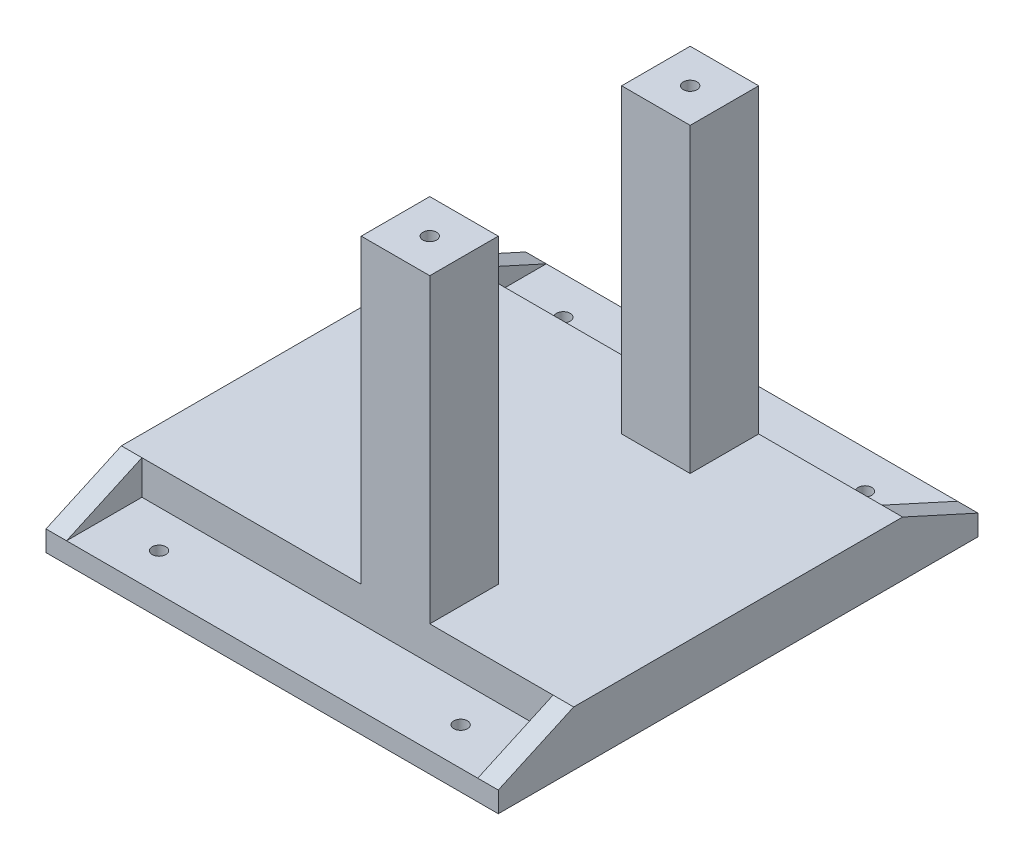
ISO-10303-21;
HEADER;
FILE_DESCRIPTION(('STEP AP214'),'2;1');
FILE_NAME('part.step','',(''),(''),'','','');
FILE_SCHEMA(('AUTOMOTIVE_DESIGN { 1 0 10303 214 1 1 1 1 }'));
ENDSEC;
DATA;
#1=APPLICATION_CONTEXT('core data for automotive mechanical design processes');
#2=APPLICATION_PROTOCOL_DEFINITION('international standard','automotive_design',2000,#1);
#3=PRODUCT_CONTEXT('',#1,'mechanical');
#4=PRODUCT('Part','Part','',(#3));
#5=PRODUCT_RELATED_PRODUCT_CATEGORY('part','',(#4));
#6=PRODUCT_DEFINITION_FORMATION('','',#4);
#7=PRODUCT_DEFINITION_CONTEXT('part definition',#1,'design');
#8=PRODUCT_DEFINITION('design','',#6,#7);
#9=PRODUCT_DEFINITION_SHAPE('','',#8);
#10=(LENGTH_UNIT() NAMED_UNIT(*) SI_UNIT(.MILLI.,.METRE.));
#11=(NAMED_UNIT(*) PLANE_ANGLE_UNIT() SI_UNIT($,.RADIAN.));
#12=(NAMED_UNIT(*) SI_UNIT($,.STERADIAN.) SOLID_ANGLE_UNIT());
#13=UNCERTAINTY_MEASURE_WITH_UNIT(LENGTH_MEASURE(1.E-05),#10,'distance_accuracy_value','');
#14=(GEOMETRIC_REPRESENTATION_CONTEXT(3) GLOBAL_UNCERTAINTY_ASSIGNED_CONTEXT((#13)) GLOBAL_UNIT_ASSIGNED_CONTEXT((#10,
#11,#12)) REPRESENTATION_CONTEXT('',''));
#15=CARTESIAN_POINT('',(0.,0.,0.));
#16=DIRECTION('',(0.,0.,1.));
#17=DIRECTION('',(1.,0.,0.));
#18=AXIS2_PLACEMENT_3D('',#15,#16,#17);
#19=CARTESIAN_POINT('',(-33.,5.,-24.));
#20=DIRECTION('',(0.,0.,1.));
#21=DIRECTION('',(1.,0.,0.));
#22=AXIS2_PLACEMENT_3D('',#19,#20,#21);
#23=PLANE('',#22);
#24=DIRECTION('',(0.,-1.,0.));
#25=VECTOR('',#24,1.);
#26=CARTESIAN_POINT('',(-30.,5.,-24.));
#27=LINE('',#26,#25);
#28=CARTESIAN_POINT('',(-30.,5.,-24.));
#29=VERTEX_POINT('',#28);
#30=CARTESIAN_POINT('',(-30.,0.,-24.));
#31=VERTEX_POINT('',#30);
#32=EDGE_CURVE('E173',#29,#31,#27,.T.);
#33=ORIENTED_EDGE('',*,*,#32,.F.);
#34=DIRECTION('',(-1.,0.,0.));
#35=VECTOR('',#34,1.);
#36=CARTESIAN_POINT('',(-33.,5.,-24.));
#37=LINE('',#36,#35);
#38=CARTESIAN_POINT('',(2.00000000000001,5.,-24.));
#39=VERTEX_POINT('',#38);
#40=EDGE_CURVE('E44',#39,#29,#37,.T.);
#41=ORIENTED_EDGE('',*,*,#40,.F.);
#42=DIRECTION('',(0.,-1.,0.));
#43=VECTOR('',#42,1.);
#44=CARTESIAN_POINT('',(2.00000000000001,49.,-24.));
#45=LINE('',#44,#43);
#46=CARTESIAN_POINT('',(2.00000000000001,49.,-24.));
#47=VERTEX_POINT('',#46);
#48=EDGE_CURVE('E221',#47,#39,#45,.T.);
#49=ORIENTED_EDGE('',*,*,#48,.F.);
#50=DIRECTION('',(-1.,0.,0.));
#51=VECTOR('',#50,1.);
#52=CARTESIAN_POINT('',(2.00000000000001,49.,-24.));
#53=LINE('',#52,#51);
#54=CARTESIAN_POINT('',(12.,49.,-24.));
#55=VERTEX_POINT('',#54);
#56=EDGE_CURVE('E224',#55,#47,#53,.T.);
#57=ORIENTED_EDGE('',*,*,#56,.F.);
#58=DIRECTION('',(0.,-1.,0.));
#59=VECTOR('',#58,1.);
#60=CARTESIAN_POINT('',(12.,49.,-24.));
#61=LINE('',#60,#59);
#62=CARTESIAN_POINT('',(12.,5.,-24.));
#63=VERTEX_POINT('',#62);
#64=EDGE_CURVE('E218',#55,#63,#61,.T.);
#65=ORIENTED_EDGE('',*,*,#64,.T.);
#66=CARTESIAN_POINT('',(30.,5.,-24.));
#67=VERTEX_POINT('',#66);
#68=EDGE_CURVE('E42',#67,#63,#37,.T.);
#69=ORIENTED_EDGE('',*,*,#68,.F.);
#70=DIRECTION('',(0.,-1.,0.));
#71=VECTOR('',#70,1.);
#72=CARTESIAN_POINT('',(30.,5.,-24.));
#73=LINE('',#72,#71);
#74=CARTESIAN_POINT('',(30.,0.,-24.));
#75=VERTEX_POINT('',#74);
#76=EDGE_CURVE('E193',#67,#75,#73,.T.);
#77=ORIENTED_EDGE('',*,*,#76,.T.);
#78=DIRECTION('',(-1.,0.,0.));
#79=VECTOR('',#78,1.);
#80=CARTESIAN_POINT('',(-33.,0.,-24.));
#81=LINE('',#80,#79);
#82=EDGE_CURVE('E37',#75,#31,#81,.T.);
#83=ORIENTED_EDGE('',*,*,#82,.T.);
#84=EDGE_LOOP('',(#33,#41,#49,#57,#65,#69,#77,#83));
#85=FACE_BOUND('',#84,.T.);
#86=ADVANCED_FACE('F33',(#85),#23,.F.);
#87=CARTESIAN_POINT('',(0.,0.,0.));
#88=DIRECTION('',(0.,-1.,0.));
#89=DIRECTION('',(0.,0.,-1.));
#90=AXIS2_PLACEMENT_3D('',#87,#88,#89);
#91=PLANE('',#90);
#92=CARTESIAN_POINT('',(-22.,0.,-29.5));
#93=DIRECTION('',(0.,1.,0.));
#94=DIRECTION('',(0.,0.,1.));
#95=AXIS2_PLACEMENT_3D('',#92,#93,#94);
#96=CIRCLE('',#95,1.);
#97=CARTESIAN_POINT('',(-22.,0.,-28.5));
#98=VERTEX_POINT('',#97);
#99=EDGE_CURVE('E355',#98,#98,#96,.T.);
#100=ORIENTED_EDGE('',*,*,#99,.F.);
#101=EDGE_LOOP('',(#100));
#102=FACE_BOUND('',#101,.T.);
#103=CARTESIAN_POINT('',(22.,0.,-29.5));
#104=DIRECTION('',(0.,1.,0.));
#105=DIRECTION('',(0.,0.,1.));
#106=AXIS2_PLACEMENT_3D('',#103,#104,#105);
#107=CIRCLE('',#106,1.);
#108=CARTESIAN_POINT('',(22.,0.,-28.5));
#109=VERTEX_POINT('',#108);
#110=EDGE_CURVE('E348',#109,#109,#107,.T.);
#111=ORIENTED_EDGE('',*,*,#110,.F.);
#112=EDGE_LOOP('',(#111));
#113=FACE_BOUND('',#112,.T.);
#114=DIRECTION('',(0.,0.,-1.));
#115=VECTOR('',#114,1.);
#116=CARTESIAN_POINT('',(-30.,0.,-24.));
#117=LINE('',#116,#115);
#118=CARTESIAN_POINT('',(-30.,0.,-35.));
#119=VERTEX_POINT('',#118);
#120=EDGE_CURVE('E176',#31,#119,#117,.T.);
#121=ORIENTED_EDGE('',*,*,#120,.F.);
#122=ORIENTED_EDGE('',*,*,#82,.F.);
#123=DIRECTION('',(0.,0.,-1.));
#124=VECTOR('',#123,1.);
#125=CARTESIAN_POINT('',(30.,0.,-24.));
#126=LINE('',#125,#124);
#127=CARTESIAN_POINT('',(30.,0.,-35.));
#128=VERTEX_POINT('',#127);
#129=EDGE_CURVE('E321',#75,#128,#126,.T.);
#130=ORIENTED_EDGE('',*,*,#129,.T.);
#131=DIRECTION('',(1.,0.,0.));
#132=VECTOR('',#131,1.);
#133=CARTESIAN_POINT('',(-33.,0.,-35.));
#134=LINE('',#133,#132);
#135=EDGE_CURVE('E188',#119,#128,#134,.T.);
#136=ORIENTED_EDGE('',*,*,#135,.F.);
#137=EDGE_LOOP('',(#121,#122,#130,#136));
#138=FACE_BOUND('',#137,.T.);
#139=ADVANCED_FACE('F186',(#102,#113,#138),#91,.F.);
#140=CARTESIAN_POINT('',(0.,5.,0.));
#141=DIRECTION('',(0.,1.,0.));
#142=DIRECTION('',(0.,0.,1.));
#143=AXIS2_PLACEMENT_3D('',#140,#141,#142);
#144=PLANE('',#143);
#145=DIRECTION('',(1.,0.,0.));
#146=VECTOR('',#145,1.);
#147=CARTESIAN_POINT('',(-33.,5.,24.));
#148=LINE('',#147,#146);
#149=CARTESIAN_POINT('',(-33.,5.,24.));
#150=VERTEX_POINT('',#149);
#151=CARTESIAN_POINT('',(-30.,5.,24.));
#152=VERTEX_POINT('',#151);
#153=EDGE_CURVE('E212',#150,#152,#148,.T.);
#154=ORIENTED_EDGE('',*,*,#153,.T.);
#155=CARTESIAN_POINT('',(2.00000000000001,5.,24.));
#156=VERTEX_POINT('',#155);
#157=EDGE_CURVE('E214',#152,#156,#148,.T.);
#158=ORIENTED_EDGE('',*,*,#157,.T.);
#159=DIRECTION('',(0.,0.,1.));
#160=VECTOR('',#159,1.);
#161=CARTESIAN_POINT('',(2.00000000000001,5.,14.));
#162=LINE('',#161,#160);
#163=CARTESIAN_POINT('',(2.00000000000001,5.,14.));
#164=VERTEX_POINT('',#163);
#165=EDGE_CURVE('E257',#164,#156,#162,.T.);
#166=ORIENTED_EDGE('',*,*,#165,.F.);
#167=DIRECTION('',(-1.,0.,0.));
#168=VECTOR('',#167,1.);
#169=CARTESIAN_POINT('',(2.00000000000001,5.,14.));
#170=LINE('',#169,#168);
#171=CARTESIAN_POINT('',(12.,5.,14.));
#172=VERTEX_POINT('',#171);
#173=EDGE_CURVE('E252',#172,#164,#170,.T.);
#174=ORIENTED_EDGE('',*,*,#173,.F.);
#175=DIRECTION('',(0.,0.,-1.));
#176=VECTOR('',#175,1.);
#177=CARTESIAN_POINT('',(12.,5.,14.));
#178=LINE('',#177,#176);
#179=CARTESIAN_POINT('',(12.,5.,24.));
#180=VERTEX_POINT('',#179);
#181=EDGE_CURVE('E255',#180,#172,#178,.T.);
#182=ORIENTED_EDGE('',*,*,#181,.F.);
#183=CARTESIAN_POINT('',(30.,5.,24.));
#184=VERTEX_POINT('',#183);
#185=EDGE_CURVE('E197',#180,#184,#148,.T.);
#186=ORIENTED_EDGE('',*,*,#185,.T.);
#187=DIRECTION('',(1.,0.,0.));
#188=VECTOR('',#187,1.);
#189=CARTESIAN_POINT('',(30.,5.,24.));
#190=LINE('',#189,#188);
#191=CARTESIAN_POINT('',(33.,5.,24.));
#192=VERTEX_POINT('',#191);
#193=EDGE_CURVE('E306',#184,#192,#190,.T.);
#194=ORIENTED_EDGE('',*,*,#193,.T.);
#195=DIRECTION('',(0.,0.,-1.));
#196=VECTOR('',#195,1.);
#197=CARTESIAN_POINT('',(33.,5.,-24.));
#198=LINE('',#197,#196);
#199=CARTESIAN_POINT('',(33.,5.,-24.));
#200=VERTEX_POINT('',#199);
#201=EDGE_CURVE('E209',#192,#200,#198,.T.);
#202=ORIENTED_EDGE('',*,*,#201,.T.);
#203=EDGE_CURVE('E11',#200,#67,#37,.T.);
#204=ORIENTED_EDGE('',*,*,#203,.T.);
#205=ORIENTED_EDGE('',*,*,#68,.T.);
#206=DIRECTION('',(0.,0.,-1.));
#207=VECTOR('',#206,1.);
#208=CARTESIAN_POINT('',(12.,5.,-24.));
#209=LINE('',#208,#207);
#210=CARTESIAN_POINT('',(12.,5.,-14.));
#211=VERTEX_POINT('',#210);
#212=EDGE_CURVE('E225',#211,#63,#209,.T.);
#213=ORIENTED_EDGE('',*,*,#212,.F.);
#214=DIRECTION('',(1.,0.,0.));
#215=VECTOR('',#214,1.);
#216=CARTESIAN_POINT('',(2.00000000000001,5.,-14.));
#217=LINE('',#216,#215);
#218=CARTESIAN_POINT('',(2.00000000000001,5.,-14.));
#219=VERTEX_POINT('',#218);
#220=EDGE_CURVE('E229',#219,#211,#217,.T.);
#221=ORIENTED_EDGE('',*,*,#220,.F.);
#222=DIRECTION('',(0.,0.,1.));
#223=VECTOR('',#222,1.);
#224=CARTESIAN_POINT('',(2.00000000000001,5.,-24.));
#225=LINE('',#224,#223);
#226=EDGE_CURVE('E232',#39,#219,#225,.T.);
#227=ORIENTED_EDGE('',*,*,#226,.F.);
#228=ORIENTED_EDGE('',*,*,#40,.T.);
#229=DIRECTION('',(-1.,0.,0.));
#230=VECTOR('',#229,1.);
#231=CARTESIAN_POINT('',(-30.,5.,-24.));
#232=LINE('',#231,#230);
#233=CARTESIAN_POINT('',(-33.,5.,-24.));
#234=VERTEX_POINT('',#233);
#235=EDGE_CURVE('E182',#29,#234,#232,.T.);
#236=ORIENTED_EDGE('',*,*,#235,.T.);
#237=DIRECTION('',(0.,0.,1.));
#238=VECTOR('',#237,1.);
#239=CARTESIAN_POINT('',(-33.,5.,-24.));
#240=LINE('',#239,#238);
#241=EDGE_CURVE('E194',#234,#150,#240,.T.);
#242=ORIENTED_EDGE('',*,*,#241,.T.);
#243=EDGE_LOOP('',(#154,#158,#166,#174,#182,#186,#194,#202,#204,#205,#213,#221,#227,#228,#236,#242));
#244=FACE_BOUND('',#243,.T.);
#245=ADVANCED_FACE('F411',(#244),#144,.T.);
#246=CARTESIAN_POINT('',(-33.,5.,-24.));
#247=DIRECTION('',(1.,0.,0.));
#248=DIRECTION('',(0.,0.,-1.));
#249=AXIS2_PLACEMENT_3D('',#246,#247,#248);
#250=PLANE('',#249);
#251=ORIENTED_EDGE('',*,*,#241,.F.);
#252=DIRECTION('',(0.,0.413802944301184,0.910366477462605));
#253=VECTOR('',#252,1.);
#254=CARTESIAN_POINT('',(-33.,0.,-35.));
#255=LINE('',#254,#253);
#256=CARTESIAN_POINT('',(-33.,0.,-35.));
#257=VERTEX_POINT('',#256);
#258=EDGE_CURVE('E344',#257,#234,#255,.T.);
#259=ORIENTED_EDGE('',*,*,#258,.F.);
#260=DIRECTION('',(0.,1.,0.));
#261=VECTOR('',#260,1.);
#262=CARTESIAN_POINT('',(-33.,-3.,-35.));
#263=LINE('',#262,#261);
#264=CARTESIAN_POINT('',(-33.,-3.,-35.));
#265=VERTEX_POINT('',#264);
#266=EDGE_CURVE('E272',#265,#257,#263,.T.);
#267=ORIENTED_EDGE('',*,*,#266,.F.);
#268=DIRECTION('',(0.,0.,-1.));
#269=VECTOR('',#268,1.);
#270=CARTESIAN_POINT('',(-33.,-3.,35.));
#271=LINE('',#270,#269);
#272=CARTESIAN_POINT('',(-33.,-3.,35.));
#273=VERTEX_POINT('',#272);
#274=EDGE_CURVE('E295',#273,#265,#271,.T.);
#275=ORIENTED_EDGE('',*,*,#274,.F.);
#276=DIRECTION('',(0.,1.,0.));
#277=VECTOR('',#276,1.);
#278=CARTESIAN_POINT('',(-33.,-3.,35.));
#279=LINE('',#278,#277);
#280=CARTESIAN_POINT('',(-33.,0.,35.));
#281=VERTEX_POINT('',#280);
#282=EDGE_CURVE('E288',#273,#281,#279,.T.);
#283=ORIENTED_EDGE('',*,*,#282,.T.);
#284=DIRECTION('',(0.,-0.413802944301184,0.910366477462605));
#285=VECTOR('',#284,1.);
#286=CARTESIAN_POINT('',(-33.,5.,24.));
#287=LINE('',#286,#285);
#288=EDGE_CURVE('E334',#150,#281,#287,.T.);
#289=ORIENTED_EDGE('',*,*,#288,.F.);
#290=EDGE_LOOP('',(#251,#259,#267,#275,#283,#289));
#291=FACE_BOUND('',#290,.T.);
#292=ADVANCED_FACE('F35',(#291),#250,.F.);
#293=CARTESIAN_POINT('',(-33.,5.,24.));
#294=DIRECTION('',(0.,0.,-1.));
#295=DIRECTION('',(-1.,0.,0.));
#296=AXIS2_PLACEMENT_3D('',#293,#294,#295);
#297=PLANE('',#296);
#298=ORIENTED_EDGE('',*,*,#157,.F.);
#299=DIRECTION('',(0.,1.,0.));
#300=VECTOR('',#299,1.);
#301=CARTESIAN_POINT('',(-30.,0.,24.));
#302=LINE('',#301,#300);
#303=CARTESIAN_POINT('',(-30.,0.,24.));
#304=VERTEX_POINT('',#303);
#305=EDGE_CURVE('E336',#304,#152,#302,.T.);
#306=ORIENTED_EDGE('',*,*,#305,.F.);
#307=DIRECTION('',(1.,0.,0.));
#308=VECTOR('',#307,1.);
#309=CARTESIAN_POINT('',(-33.,0.,24.));
#310=LINE('',#309,#308);
#311=CARTESIAN_POINT('',(30.,0.,24.));
#312=VERTEX_POINT('',#311);
#313=EDGE_CURVE('E195',#304,#312,#310,.T.);
#314=ORIENTED_EDGE('',*,*,#313,.T.);
#315=DIRECTION('',(0.,1.,0.));
#316=VECTOR('',#315,1.);
#317=CARTESIAN_POINT('',(30.,0.,24.));
#318=LINE('',#317,#316);
#319=EDGE_CURVE('E312',#312,#184,#318,.T.);
#320=ORIENTED_EDGE('',*,*,#319,.T.);
#321=ORIENTED_EDGE('',*,*,#185,.F.);
#322=DIRECTION('',(0.,-1.,0.));
#323=VECTOR('',#322,1.);
#324=CARTESIAN_POINT('',(12.,49.,24.));
#325=LINE('',#324,#323);
#326=CARTESIAN_POINT('',(12.,49.,24.));
#327=VERTEX_POINT('',#326);
#328=EDGE_CURVE('E245',#327,#180,#325,.T.);
#329=ORIENTED_EDGE('',*,*,#328,.F.);
#330=DIRECTION('',(1.,0.,0.));
#331=VECTOR('',#330,1.);
#332=CARTESIAN_POINT('',(2.00000000000001,49.,24.));
#333=LINE('',#332,#331);
#334=CARTESIAN_POINT('',(2.00000000000001,49.,24.));
#335=VERTEX_POINT('',#334);
#336=EDGE_CURVE('E264',#335,#327,#333,.T.);
#337=ORIENTED_EDGE('',*,*,#336,.F.);
#338=DIRECTION('',(0.,-1.,0.));
#339=VECTOR('',#338,1.);
#340=CARTESIAN_POINT('',(2.00000000000001,49.,24.));
#341=LINE('',#340,#339);
#342=EDGE_CURVE('E235',#335,#156,#341,.T.);
#343=ORIENTED_EDGE('',*,*,#342,.T.);
#344=EDGE_LOOP('',(#298,#306,#314,#320,#321,#329,#337,#343));
#345=FACE_BOUND('',#344,.T.);
#346=ADVANCED_FACE('F436',(#345),#297,.F.);
#347=CARTESIAN_POINT('',(33.,5.,-24.));
#348=DIRECTION('',(-1.,0.,0.));
#349=DIRECTION('',(0.,0.,1.));
#350=AXIS2_PLACEMENT_3D('',#347,#348,#349);
#351=PLANE('',#350);
#352=ORIENTED_EDGE('',*,*,#201,.F.);
#353=DIRECTION('',(0.,-0.413802944301184,0.910366477462605));
#354=VECTOR('',#353,1.);
#355=CARTESIAN_POINT('',(33.,5.,24.));
#356=LINE('',#355,#354);
#357=CARTESIAN_POINT('',(33.,0.,35.));
#358=VERTEX_POINT('',#357);
#359=EDGE_CURVE('E310',#192,#358,#356,.T.);
#360=ORIENTED_EDGE('',*,*,#359,.T.);
#361=DIRECTION('',(0.,1.,0.));
#362=VECTOR('',#361,1.);
#363=CARTESIAN_POINT('',(33.,-3.,35.));
#364=LINE('',#363,#362);
#365=CARTESIAN_POINT('',(33.,-3.,35.));
#366=VERTEX_POINT('',#365);
#367=EDGE_CURVE('E285',#366,#358,#364,.T.);
#368=ORIENTED_EDGE('',*,*,#367,.F.);
#369=DIRECTION('',(0.,0.,1.));
#370=VECTOR('',#369,1.);
#371=CARTESIAN_POINT('',(33.,-3.,35.));
#372=LINE('',#371,#370);
#373=CARTESIAN_POINT('',(33.,-3.,-35.));
#374=VERTEX_POINT('',#373);
#375=EDGE_CURVE('E300',#374,#366,#372,.T.);
#376=ORIENTED_EDGE('',*,*,#375,.F.);
#377=DIRECTION('',(0.,1.,0.));
#378=VECTOR('',#377,1.);
#379=CARTESIAN_POINT('',(33.,-3.,-35.));
#380=LINE('',#379,#378);
#381=CARTESIAN_POINT('',(33.,0.,-35.));
#382=VERTEX_POINT('',#381);
#383=EDGE_CURVE('E282',#374,#382,#380,.T.);
#384=ORIENTED_EDGE('',*,*,#383,.T.);
#385=DIRECTION('',(0.,0.413802944301184,0.910366477462605));
#386=VECTOR('',#385,1.);
#387=CARTESIAN_POINT('',(33.,0.,-35.));
#388=LINE('',#387,#386);
#389=EDGE_CURVE('E322',#382,#200,#388,.T.);
#390=ORIENTED_EDGE('',*,*,#389,.T.);
#391=EDGE_LOOP('',(#352,#360,#368,#376,#384,#390));
#392=FACE_BOUND('',#391,.T.);
#393=ADVANCED_FACE('F402',(#392),#351,.F.);
#394=CARTESIAN_POINT('',(2.00000000000001,49.,-24.));
#395=DIRECTION('',(1.,0.,0.));
#396=DIRECTION('',(0.,0.,-1.));
#397=AXIS2_PLACEMENT_3D('',#394,#395,#396);
#398=PLANE('',#397);
#399=ORIENTED_EDGE('',*,*,#226,.T.);
#400=DIRECTION('',(0.,-1.,0.));
#401=VECTOR('',#400,1.);
#402=CARTESIAN_POINT('',(2.00000000000001,49.,-14.));
#403=LINE('',#402,#401);
#404=CARTESIAN_POINT('',(2.00000000000001,49.,-14.));
#405=VERTEX_POINT('',#404);
#406=EDGE_CURVE('E199',#405,#219,#403,.T.);
#407=ORIENTED_EDGE('',*,*,#406,.F.);
#408=DIRECTION('',(0.,0.,1.));
#409=VECTOR('',#408,1.);
#410=CARTESIAN_POINT('',(2.00000000000001,49.,-24.));
#411=LINE('',#410,#409);
#412=EDGE_CURVE('E228',#47,#405,#411,.T.);
#413=ORIENTED_EDGE('',*,*,#412,.F.);
#414=ORIENTED_EDGE('',*,*,#48,.T.);
#415=EDGE_LOOP('',(#399,#407,#413,#414));
#416=FACE_BOUND('',#415,.T.);
#417=ADVANCED_FACE('F435',(#416),#398,.F.);
#418=CARTESIAN_POINT('',(2.00000000000001,49.,-14.));
#419=DIRECTION('',(0.,0.,-1.));
#420=DIRECTION('',(-1.,0.,0.));
#421=AXIS2_PLACEMENT_3D('',#418,#419,#420);
#422=PLANE('',#421);
#423=ORIENTED_EDGE('',*,*,#220,.T.);
#424=DIRECTION('',(0.,-1.,0.));
#425=VECTOR('',#424,1.);
#426=CARTESIAN_POINT('',(12.,49.,-14.));
#427=LINE('',#426,#425);
#428=CARTESIAN_POINT('',(12.,49.,-14.));
#429=VERTEX_POINT('',#428);
#430=EDGE_CURVE('E206',#429,#211,#427,.T.);
#431=ORIENTED_EDGE('',*,*,#430,.F.);
#432=DIRECTION('',(1.,0.,0.));
#433=VECTOR('',#432,1.);
#434=CARTESIAN_POINT('',(2.00000000000001,49.,-14.));
#435=LINE('',#434,#433);
#436=EDGE_CURVE('E239',#405,#429,#435,.T.);
#437=ORIENTED_EDGE('',*,*,#436,.F.);
#438=ORIENTED_EDGE('',*,*,#406,.T.);
#439=EDGE_LOOP('',(#423,#431,#437,#438));
#440=FACE_BOUND('',#439,.T.);
#441=ADVANCED_FACE('F512',(#440),#422,.F.);
#442=CARTESIAN_POINT('',(12.,49.,-24.));
#443=DIRECTION('',(-1.,0.,0.));
#444=DIRECTION('',(0.,0.,1.));
#445=AXIS2_PLACEMENT_3D('',#442,#443,#444);
#446=PLANE('',#445);
#447=ORIENTED_EDGE('',*,*,#212,.T.);
#448=ORIENTED_EDGE('',*,*,#64,.F.);
#449=DIRECTION('',(0.,0.,-1.));
#450=VECTOR('',#449,1.);
#451=CARTESIAN_POINT('',(12.,49.,-24.));
#452=LINE('',#451,#450);
#453=EDGE_CURVE('E237',#429,#55,#452,.T.);
#454=ORIENTED_EDGE('',*,*,#453,.F.);
#455=ORIENTED_EDGE('',*,*,#430,.T.);
#456=EDGE_LOOP('',(#447,#448,#454,#455));
#457=FACE_BOUND('',#456,.T.);
#458=ADVANCED_FACE('F508',(#457),#446,.F.);
#459=CARTESIAN_POINT('',(0.,49.,0.));
#460=DIRECTION('',(0.,1.,0.));
#461=DIRECTION('',(0.,0.,1.));
#462=AXIS2_PLACEMENT_3D('',#459,#460,#461);
#463=PLANE('',#462);
#464=CARTESIAN_POINT('',(7.00000000000001,49.,-19.));
#465=DIRECTION('',(0.,1.,0.));
#466=DIRECTION('',(0.,0.,1.));
#467=AXIS2_PLACEMENT_3D('',#464,#465,#466);
#468=CIRCLE('',#467,1.);
#469=CARTESIAN_POINT('',(7.00000000000001,49.,-18.));
#470=VERTEX_POINT('',#469);
#471=EDGE_CURVE('E275',#470,#470,#468,.T.);
#472=ORIENTED_EDGE('',*,*,#471,.F.);
#473=EDGE_LOOP('',(#472));
#474=FACE_BOUND('',#473,.T.);
#475=ORIENTED_EDGE('',*,*,#412,.T.);
#476=ORIENTED_EDGE('',*,*,#436,.T.);
#477=ORIENTED_EDGE('',*,*,#453,.T.);
#478=ORIENTED_EDGE('',*,*,#56,.T.);
#479=EDGE_LOOP('',(#475,#476,#477,#478));
#480=FACE_BOUND('',#479,.T.);
#481=ADVANCED_FACE('F504',(#474,#480),#463,.T.);
#482=CARTESIAN_POINT('',(2.00000000000001,49.,14.));
#483=DIRECTION('',(1.,0.,0.));
#484=DIRECTION('',(0.,0.,-1.));
#485=AXIS2_PLACEMENT_3D('',#482,#483,#484);
#486=PLANE('',#485);
#487=ORIENTED_EDGE('',*,*,#165,.T.);
#488=ORIENTED_EDGE('',*,*,#342,.F.);
#489=DIRECTION('',(0.,0.,1.));
#490=VECTOR('',#489,1.);
#491=CARTESIAN_POINT('',(2.00000000000001,49.,14.));
#492=LINE('',#491,#490);
#493=CARTESIAN_POINT('',(2.00000000000001,49.,14.));
#494=VERTEX_POINT('',#493);
#495=EDGE_CURVE('E254',#494,#335,#492,.T.);
#496=ORIENTED_EDGE('',*,*,#495,.F.);
#497=DIRECTION('',(0.,-1.,0.));
#498=VECTOR('',#497,1.);
#499=CARTESIAN_POINT('',(2.00000000000001,49.,14.));
#500=LINE('',#499,#498);
#501=EDGE_CURVE('E248',#494,#164,#500,.T.);
#502=ORIENTED_EDGE('',*,*,#501,.T.);
#503=EDGE_LOOP('',(#487,#488,#496,#502));
#504=FACE_BOUND('',#503,.T.);
#505=ADVANCED_FACE('F500',(#504),#486,.F.);
#506=CARTESIAN_POINT('',(12.,49.,14.));
#507=DIRECTION('',(-1.,0.,0.));
#508=DIRECTION('',(0.,0.,1.));
#509=AXIS2_PLACEMENT_3D('',#506,#507,#508);
#510=PLANE('',#509);
#511=ORIENTED_EDGE('',*,*,#181,.T.);
#512=DIRECTION('',(0.,-1.,0.));
#513=VECTOR('',#512,1.);
#514=CARTESIAN_POINT('',(12.,49.,14.));
#515=LINE('',#514,#513);
#516=CARTESIAN_POINT('',(12.,49.,14.));
#517=VERTEX_POINT('',#516);
#518=EDGE_CURVE('E59',#517,#172,#515,.T.);
#519=ORIENTED_EDGE('',*,*,#518,.F.);
#520=DIRECTION('',(0.,0.,-1.));
#521=VECTOR('',#520,1.);
#522=CARTESIAN_POINT('',(12.,49.,14.));
#523=LINE('',#522,#521);
#524=EDGE_CURVE('E262',#327,#517,#523,.T.);
#525=ORIENTED_EDGE('',*,*,#524,.F.);
#526=ORIENTED_EDGE('',*,*,#328,.T.);
#527=EDGE_LOOP('',(#511,#519,#525,#526));
#528=FACE_BOUND('',#527,.T.);
#529=ADVANCED_FACE('F497',(#528),#510,.F.);
#530=CARTESIAN_POINT('',(2.00000000000001,49.,14.));
#531=DIRECTION('',(0.,0.,1.));
#532=DIRECTION('',(1.,0.,0.));
#533=AXIS2_PLACEMENT_3D('',#530,#531,#532);
#534=PLANE('',#533);
#535=ORIENTED_EDGE('',*,*,#173,.T.);
#536=ORIENTED_EDGE('',*,*,#501,.F.);
#537=DIRECTION('',(-1.,0.,0.));
#538=VECTOR('',#537,1.);
#539=CARTESIAN_POINT('',(2.00000000000001,49.,14.));
#540=LINE('',#539,#538);
#541=EDGE_CURVE('E251',#517,#494,#540,.T.);
#542=ORIENTED_EDGE('',*,*,#541,.F.);
#543=ORIENTED_EDGE('',*,*,#518,.T.);
#544=EDGE_LOOP('',(#535,#536,#542,#543));
#545=FACE_BOUND('',#544,.T.);
#546=ADVANCED_FACE('F493',(#545),#534,.F.);
#547=CARTESIAN_POINT('',(0.,49.,0.));
#548=DIRECTION('',(0.,1.,0.));
#549=DIRECTION('',(0.,0.,1.));
#550=AXIS2_PLACEMENT_3D('',#547,#548,#549);
#551=PLANE('',#550);
#552=CARTESIAN_POINT('',(7.00000000000001,49.,19.));
#553=DIRECTION('',(0.,1.,0.));
#554=DIRECTION('',(0.,0.,1.));
#555=AXIS2_PLACEMENT_3D('',#552,#553,#554);
#556=CIRCLE('',#555,1.);
#557=CARTESIAN_POINT('',(7.00000000000001,49.,20.));
#558=VERTEX_POINT('',#557);
#559=EDGE_CURVE('E268',#558,#558,#556,.T.);
#560=ORIENTED_EDGE('',*,*,#559,.F.);
#561=EDGE_LOOP('',(#560));
#562=FACE_BOUND('',#561,.T.);
#563=ORIENTED_EDGE('',*,*,#495,.T.);
#564=ORIENTED_EDGE('',*,*,#336,.T.);
#565=ORIENTED_EDGE('',*,*,#524,.T.);
#566=ORIENTED_EDGE('',*,*,#541,.T.);
#567=EDGE_LOOP('',(#563,#564,#565,#566));
#568=FACE_BOUND('',#567,.T.);
#569=ADVANCED_FACE('F489',(#562,#568),#551,.T.);
#570=CARTESIAN_POINT('',(7.00000000000001,42.,19.));
#571=DIRECTION('',(0.,1.,0.));
#572=DIRECTION('',(0.,0.,1.));
#573=AXIS2_PLACEMENT_3D('',#570,#571,#572);
#574=CYLINDRICAL_SURFACE('',#573,1.);
#575=CARTESIAN_POINT('',(7.00000000000001,42.,19.));
#576=DIRECTION('',(0.,1.,0.));
#577=DIRECTION('',(0.,0.,1.));
#578=AXIS2_PLACEMENT_3D('',#575,#576,#577);
#579=CIRCLE('',#578,1.);
#580=CARTESIAN_POINT('',(7.00000000000001,42.,20.));
#581=VERTEX_POINT('',#580);
#582=EDGE_CURVE('E271',#581,#581,#579,.T.);
#583=ORIENTED_EDGE('',*,*,#582,.F.);
#584=EDGE_LOOP('',(#583));
#585=FACE_BOUND('',#584,.T.);
#586=ORIENTED_EDGE('',*,*,#559,.T.);
#587=EDGE_LOOP('',(#586));
#588=FACE_BOUND('',#587,.T.);
#589=ADVANCED_FACE('F485',(#585,#588),#574,.F.);
#590=CARTESIAN_POINT('',(7.00000000000001,42.,19.));
#591=DIRECTION('',(0.,1.,0.));
#592=DIRECTION('',(0.,0.,1.));
#593=AXIS2_PLACEMENT_3D('',#590,#591,#592);
#594=PLANE('',#593);
#595=ORIENTED_EDGE('',*,*,#582,.T.);
#596=EDGE_LOOP('',(#595));
#597=FACE_BOUND('',#596,.T.);
#598=ADVANCED_FACE('F481',(#597),#594,.T.);
#599=CARTESIAN_POINT('',(7.00000000000001,42.,-19.));
#600=DIRECTION('',(0.,1.,0.));
#601=DIRECTION('',(0.,0.,1.));
#602=AXIS2_PLACEMENT_3D('',#599,#600,#601);
#603=CYLINDRICAL_SURFACE('',#602,1.);
#604=CARTESIAN_POINT('',(7.00000000000001,42.,-19.));
#605=DIRECTION('',(0.,1.,0.));
#606=DIRECTION('',(0.,0.,1.));
#607=AXIS2_PLACEMENT_3D('',#604,#605,#606);
#608=CIRCLE('',#607,1.);
#609=CARTESIAN_POINT('',(7.00000000000001,42.,-18.));
#610=VERTEX_POINT('',#609);
#611=EDGE_CURVE('E260',#610,#610,#608,.T.);
#612=ORIENTED_EDGE('',*,*,#611,.F.);
#613=EDGE_LOOP('',(#612));
#614=FACE_BOUND('',#613,.T.);
#615=ORIENTED_EDGE('',*,*,#471,.T.);
#616=EDGE_LOOP('',(#615));
#617=FACE_BOUND('',#616,.T.);
#618=ADVANCED_FACE('F477',(#614,#617),#603,.F.);
#619=CARTESIAN_POINT('',(7.00000000000001,42.,-19.));
#620=DIRECTION('',(0.,1.,0.));
#621=DIRECTION('',(0.,0.,1.));
#622=AXIS2_PLACEMENT_3D('',#619,#620,#621);
#623=PLANE('',#622);
#624=ORIENTED_EDGE('',*,*,#611,.T.);
#625=EDGE_LOOP('',(#624));
#626=FACE_BOUND('',#625,.T.);
#627=ADVANCED_FACE('F474',(#626),#623,.T.);
#628=CARTESIAN_POINT('',(-33.,-3.,-35.));
#629=DIRECTION('',(0.,0.,1.));
#630=DIRECTION('',(1.,0.,0.));
#631=AXIS2_PLACEMENT_3D('',#628,#629,#630);
#632=PLANE('',#631);
#633=EDGE_CURVE('E297',#257,#119,#134,.T.);
#634=ORIENTED_EDGE('',*,*,#633,.T.);
#635=ORIENTED_EDGE('',*,*,#135,.T.);
#636=DIRECTION('',(1.,0.,0.));
#637=VECTOR('',#636,1.);
#638=CARTESIAN_POINT('',(30.,0.,-35.));
#639=LINE('',#638,#637);
#640=EDGE_CURVE('E313',#128,#382,#639,.T.);
#641=ORIENTED_EDGE('',*,*,#640,.T.);
#642=ORIENTED_EDGE('',*,*,#383,.F.);
#643=DIRECTION('',(1.,0.,0.));
#644=VECTOR('',#643,1.);
#645=CARTESIAN_POINT('',(-33.,-3.,-35.));
#646=LINE('',#645,#644);
#647=EDGE_CURVE('E302',#265,#374,#646,.T.);
#648=ORIENTED_EDGE('',*,*,#647,.F.);
#649=ORIENTED_EDGE('',*,*,#266,.T.);
#650=EDGE_LOOP('',(#634,#635,#641,#642,#648,#649));
#651=FACE_BOUND('',#650,.T.);
#652=ADVANCED_FACE('F396',(#651),#632,.F.);
#653=CARTESIAN_POINT('',(-33.,-3.,35.));
#654=DIRECTION('',(0.,0.,-1.));
#655=DIRECTION('',(-1.,0.,0.));
#656=AXIS2_PLACEMENT_3D('',#653,#654,#655);
#657=PLANE('',#656);
#658=DIRECTION('',(-1.,0.,0.));
#659=VECTOR('',#658,1.);
#660=CARTESIAN_POINT('',(-33.,0.,35.));
#661=LINE('',#660,#659);
#662=CARTESIAN_POINT('',(30.,0.,35.));
#663=VERTEX_POINT('',#662);
#664=EDGE_CURVE('E292',#358,#663,#661,.T.);
#665=ORIENTED_EDGE('',*,*,#664,.T.);
#666=CARTESIAN_POINT('',(-30.,0.,35.));
#667=VERTEX_POINT('',#666);
#668=EDGE_CURVE('E296',#663,#667,#661,.T.);
#669=ORIENTED_EDGE('',*,*,#668,.T.);
#670=DIRECTION('',(-1.,0.,0.));
#671=VECTOR('',#670,1.);
#672=CARTESIAN_POINT('',(-30.,0.,35.));
#673=LINE('',#672,#671);
#674=EDGE_CURVE('E326',#667,#281,#673,.T.);
#675=ORIENTED_EDGE('',*,*,#674,.T.);
#676=ORIENTED_EDGE('',*,*,#282,.F.);
#677=DIRECTION('',(-1.,0.,0.));
#678=VECTOR('',#677,1.);
#679=CARTESIAN_POINT('',(-33.,-3.,35.));
#680=LINE('',#679,#678);
#681=EDGE_CURVE('E291',#366,#273,#680,.T.);
#682=ORIENTED_EDGE('',*,*,#681,.F.);
#683=ORIENTED_EDGE('',*,*,#367,.T.);
#684=EDGE_LOOP('',(#665,#669,#675,#676,#682,#683));
#685=FACE_BOUND('',#684,.T.);
#686=ADVANCED_FACE('F379',(#685),#657,.F.);
#687=CARTESIAN_POINT('',(0.,-3.,0.));
#688=DIRECTION('',(0.,-1.,0.));
#689=DIRECTION('',(0.,0.,-1.));
#690=AXIS2_PLACEMENT_3D('',#687,#688,#689);
#691=PLANE('',#690);
#692=CARTESIAN_POINT('',(-22.,-3.,29.5));
#693=DIRECTION('',(0.,-1.,0.));
#694=DIRECTION('',(0.,0.,-1.));
#695=AXIS2_PLACEMENT_3D('',#692,#693,#694);
#696=CIRCLE('',#695,1.);
#697=CARTESIAN_POINT('',(-22.,-3.,28.5));
#698=VERTEX_POINT('',#697);
#699=EDGE_CURVE('E352',#698,#698,#696,.T.);
#700=ORIENTED_EDGE('',*,*,#699,.F.);
#701=EDGE_LOOP('',(#700));
#702=FACE_BOUND('',#701,.T.);
#703=CARTESIAN_POINT('',(22.,-3.,29.5));
#704=DIRECTION('',(0.,-1.,0.));
#705=DIRECTION('',(0.,0.,-1.));
#706=AXIS2_PLACEMENT_3D('',#703,#704,#705);
#707=CIRCLE('',#706,1.);
#708=CARTESIAN_POINT('',(22.,-3.,28.5));
#709=VERTEX_POINT('',#708);
#710=EDGE_CURVE('E363',#709,#709,#707,.T.);
#711=ORIENTED_EDGE('',*,*,#710,.F.);
#712=EDGE_LOOP('',(#711));
#713=FACE_BOUND('',#712,.T.);
#714=CARTESIAN_POINT('',(-22.,-3.,-29.5));
#715=DIRECTION('',(0.,1.,0.));
#716=DIRECTION('',(0.,0.,1.));
#717=AXIS2_PLACEMENT_3D('',#714,#715,#716);
#718=CIRCLE('',#717,1.);
#719=CARTESIAN_POINT('',(-22.,-3.,-28.5));
#720=VERTEX_POINT('',#719);
#721=EDGE_CURVE('E345',#720,#720,#718,.T.);
#722=ORIENTED_EDGE('',*,*,#721,.T.);
#723=EDGE_LOOP('',(#722));
#724=FACE_BOUND('',#723,.T.);
#725=CARTESIAN_POINT('',(22.,-3.,-29.5));
#726=DIRECTION('',(0.,1.,0.));
#727=DIRECTION('',(0.,0.,1.));
#728=AXIS2_PLACEMENT_3D('',#725,#726,#727);
#729=CIRCLE('',#728,1.);
#730=CARTESIAN_POINT('',(22.,-3.,-28.5));
#731=VERTEX_POINT('',#730);
#732=EDGE_CURVE('E351',#731,#731,#729,.T.);
#733=ORIENTED_EDGE('',*,*,#732,.T.);
#734=EDGE_LOOP('',(#733));
#735=FACE_BOUND('',#734,.T.);
#736=ORIENTED_EDGE('',*,*,#274,.T.);
#737=ORIENTED_EDGE('',*,*,#647,.T.);
#738=ORIENTED_EDGE('',*,*,#375,.T.);
#739=ORIENTED_EDGE('',*,*,#681,.T.);
#740=EDGE_LOOP('',(#736,#737,#738,#739));
#741=FACE_BOUND('',#740,.T.);
#742=ADVANCED_FACE('F375',(#702,#713,#724,#735,#741),#691,.T.);
#743=CARTESIAN_POINT('',(-22.,0.,29.5));
#744=DIRECTION('',(0.,-1.,0.));
#745=DIRECTION('',(0.,0.,-1.));
#746=AXIS2_PLACEMENT_3D('',#743,#744,#745);
#747=CIRCLE('',#746,1.);
#748=CARTESIAN_POINT('',(-22.,0.,28.5));
#749=VERTEX_POINT('',#748);
#750=EDGE_CURVE('E366',#749,#749,#747,.T.);
#751=ORIENTED_EDGE('',*,*,#750,.T.);
#752=EDGE_LOOP('',(#751));
#753=FACE_BOUND('',#752,.T.);
#754=CARTESIAN_POINT('',(22.,0.,29.5));
#755=DIRECTION('',(0.,-1.,0.));
#756=DIRECTION('',(0.,0.,-1.));
#757=AXIS2_PLACEMENT_3D('',#754,#755,#756);
#758=CIRCLE('',#757,1.);
#759=CARTESIAN_POINT('',(22.,0.,28.5));
#760=VERTEX_POINT('',#759);
#761=EDGE_CURVE('E360',#760,#760,#758,.T.);
#762=ORIENTED_EDGE('',*,*,#761,.T.);
#763=EDGE_LOOP('',(#762));
#764=FACE_BOUND('',#763,.T.);
#765=ORIENTED_EDGE('',*,*,#313,.F.);
#766=DIRECTION('',(0.,0.,-1.));
#767=VECTOR('',#766,1.);
#768=CARTESIAN_POINT('',(-30.,0.,35.));
#769=LINE('',#768,#767);
#770=EDGE_CURVE('E338',#667,#304,#769,.T.);
#771=ORIENTED_EDGE('',*,*,#770,.F.);
#772=ORIENTED_EDGE('',*,*,#668,.F.);
#773=DIRECTION('',(0.,0.,-1.));
#774=VECTOR('',#773,1.);
#775=CARTESIAN_POINT('',(30.,0.,35.));
#776=LINE('',#775,#774);
#777=EDGE_CURVE('E309',#663,#312,#776,.T.);
#778=ORIENTED_EDGE('',*,*,#777,.T.);
#779=EDGE_LOOP('',(#765,#771,#772,#778));
#780=FACE_BOUND('',#779,.T.);
#781=ADVANCED_FACE('F378',(#753,#764,#780),#91,.F.);
#782=CARTESIAN_POINT('',(30.,5.,24.));
#783=DIRECTION('',(0.,0.910366477462605,0.413802944301184));
#784=DIRECTION('',(0.,-0.413802944301184,0.910366477462605));
#785=AXIS2_PLACEMENT_3D('',#782,#783,#784);
#786=PLANE('',#785);
#787=ORIENTED_EDGE('',*,*,#359,.F.);
#788=ORIENTED_EDGE('',*,*,#193,.F.);
#789=DIRECTION('',(0.,-0.413802944301184,0.910366477462605));
#790=VECTOR('',#789,1.);
#791=CARTESIAN_POINT('',(30.,5.,24.));
#792=LINE('',#791,#790);
#793=EDGE_CURVE('E316',#184,#663,#792,.T.);
#794=ORIENTED_EDGE('',*,*,#793,.T.);
#795=ORIENTED_EDGE('',*,*,#664,.F.);
#796=EDGE_LOOP('',(#787,#788,#794,#795));
#797=FACE_BOUND('',#796,.T.);
#798=ADVANCED_FACE('F458',(#797),#786,.T.);
#799=CARTESIAN_POINT('',(30.,0.,0.));
#800=DIRECTION('',(-1.,0.,0.));
#801=DIRECTION('',(0.,0.,1.));
#802=AXIS2_PLACEMENT_3D('',#799,#800,#801);
#803=PLANE('',#802);
#804=ORIENTED_EDGE('',*,*,#319,.F.);
#805=ORIENTED_EDGE('',*,*,#777,.F.);
#806=ORIENTED_EDGE('',*,*,#793,.F.);
#807=EDGE_LOOP('',(#804,#805,#806));
#808=FACE_BOUND('',#807,.T.);
#809=ADVANCED_FACE('F453',(#808),#803,.T.);
#810=CARTESIAN_POINT('',(30.,0.,-35.));
#811=DIRECTION('',(0.,0.910366477462605,-0.413802944301184));
#812=DIRECTION('',(0.,0.413802944301184,0.910366477462605));
#813=AXIS2_PLACEMENT_3D('',#810,#811,#812);
#814=PLANE('',#813);
#815=ORIENTED_EDGE('',*,*,#389,.F.);
#816=ORIENTED_EDGE('',*,*,#640,.F.);
#817=DIRECTION('',(0.,0.413802944301184,0.910366477462605));
#818=VECTOR('',#817,1.);
#819=CARTESIAN_POINT('',(30.,0.,-35.));
#820=LINE('',#819,#818);
#821=EDGE_CURVE('E325',#128,#67,#820,.T.);
#822=ORIENTED_EDGE('',*,*,#821,.T.);
#823=ORIENTED_EDGE('',*,*,#203,.F.);
#824=EDGE_LOOP('',(#815,#816,#822,#823));
#825=FACE_BOUND('',#824,.T.);
#826=ADVANCED_FACE('F465',(#825),#814,.T.);
#827=CARTESIAN_POINT('',(30.,0.,0.));
#828=DIRECTION('',(1.,0.,0.));
#829=DIRECTION('',(0.,0.,-1.));
#830=AXIS2_PLACEMENT_3D('',#827,#828,#829);
#831=PLANE('',#830);
#832=ORIENTED_EDGE('',*,*,#821,.F.);
#833=ORIENTED_EDGE('',*,*,#129,.F.);
#834=ORIENTED_EDGE('',*,*,#76,.F.);
#835=EDGE_LOOP('',(#832,#833,#834));
#836=FACE_BOUND('',#835,.T.);
#837=ADVANCED_FACE('F531',(#836),#831,.F.);
#838=CARTESIAN_POINT('',(-30.,5.,24.));
#839=DIRECTION('',(0.,-0.910366477462605,-0.413802944301184));
#840=DIRECTION('',(0.,0.413802944301184,-0.910366477462605));
#841=AXIS2_PLACEMENT_3D('',#838,#839,#840);
#842=PLANE('',#841);
#843=ORIENTED_EDGE('',*,*,#288,.T.);
#844=ORIENTED_EDGE('',*,*,#674,.F.);
#845=DIRECTION('',(0.,-0.413802944301184,0.910366477462605));
#846=VECTOR('',#845,1.);
#847=CARTESIAN_POINT('',(-30.,5.,24.));
#848=LINE('',#847,#846);
#849=EDGE_CURVE('E333',#152,#667,#848,.T.);
#850=ORIENTED_EDGE('',*,*,#849,.F.);
#851=ORIENTED_EDGE('',*,*,#153,.F.);
#852=EDGE_LOOP('',(#843,#844,#850,#851));
#853=FACE_BOUND('',#852,.T.);
#854=ADVANCED_FACE('F409',(#853),#842,.F.);
#855=CARTESIAN_POINT('',(-30.,0.,0.));
#856=DIRECTION('',(1.,0.,0.));
#857=DIRECTION('',(0.,0.,1.));
#858=AXIS2_PLACEMENT_3D('',#855,#856,#857);
#859=PLANE('',#858);
#860=ORIENTED_EDGE('',*,*,#305,.T.);
#861=ORIENTED_EDGE('',*,*,#849,.T.);
#862=ORIENTED_EDGE('',*,*,#770,.T.);
#863=EDGE_LOOP('',(#860,#861,#862));
#864=FACE_BOUND('',#863,.T.);
#865=ADVANCED_FACE('F414',(#864),#859,.T.);
#866=CARTESIAN_POINT('',(-30.,0.,-35.));
#867=DIRECTION('',(0.,-0.910366477462605,0.413802944301184));
#868=DIRECTION('',(0.,-0.413802944301184,-0.910366477462605));
#869=AXIS2_PLACEMENT_3D('',#866,#867,#868);
#870=PLANE('',#869);
#871=ORIENTED_EDGE('',*,*,#258,.T.);
#872=ORIENTED_EDGE('',*,*,#235,.F.);
#873=DIRECTION('',(0.,0.413802944301184,0.910366477462605));
#874=VECTOR('',#873,1.);
#875=CARTESIAN_POINT('',(-30.,0.,-35.));
#876=LINE('',#875,#874);
#877=EDGE_CURVE('E51',#119,#29,#876,.T.);
#878=ORIENTED_EDGE('',*,*,#877,.F.);
#879=ORIENTED_EDGE('',*,*,#633,.F.);
#880=EDGE_LOOP('',(#871,#872,#878,#879));
#881=FACE_BOUND('',#880,.T.);
#882=ADVANCED_FACE('F412',(#881),#870,.F.);
#883=CARTESIAN_POINT('',(-30.,0.,0.));
#884=DIRECTION('',(-1.,0.,0.));
#885=DIRECTION('',(0.,0.,-1.));
#886=AXIS2_PLACEMENT_3D('',#883,#884,#885);
#887=PLANE('',#886);
#888=ORIENTED_EDGE('',*,*,#877,.T.);
#889=ORIENTED_EDGE('',*,*,#32,.T.);
#890=ORIENTED_EDGE('',*,*,#120,.T.);
#891=EDGE_LOOP('',(#888,#889,#890));
#892=FACE_BOUND('',#891,.T.);
#893=ADVANCED_FACE('F175',(#892),#887,.F.);
#894=CARTESIAN_POINT('',(22.,-3.,-29.5));
#895=DIRECTION('',(0.,1.,0.));
#896=DIRECTION('',(0.,0.,1.));
#897=AXIS2_PLACEMENT_3D('',#894,#895,#896);
#898=CYLINDRICAL_SURFACE('',#897,1.);
#899=ORIENTED_EDGE('',*,*,#732,.F.);
#900=EDGE_LOOP('',(#899));
#901=FACE_BOUND('',#900,.T.);
#902=ORIENTED_EDGE('',*,*,#110,.T.);
#903=EDGE_LOOP('',(#902));
#904=FACE_BOUND('',#903,.T.);
#905=ADVANCED_FACE('F420',(#901,#904),#898,.F.);
#906=CARTESIAN_POINT('',(-22.,-3.,-29.5));
#907=DIRECTION('',(0.,1.,0.));
#908=DIRECTION('',(0.,0.,1.));
#909=AXIS2_PLACEMENT_3D('',#906,#907,#908);
#910=CYLINDRICAL_SURFACE('',#909,1.);
#911=ORIENTED_EDGE('',*,*,#721,.F.);
#912=EDGE_LOOP('',(#911));
#913=FACE_BOUND('',#912,.T.);
#914=ORIENTED_EDGE('',*,*,#99,.T.);
#915=EDGE_LOOP('',(#914));
#916=FACE_BOUND('',#915,.T.);
#917=ADVANCED_FACE('F686',(#913,#916),#910,.F.);
#918=CARTESIAN_POINT('',(22.,-3.,29.5));
#919=DIRECTION('',(0.,1.,0.));
#920=DIRECTION('',(0.,0.,1.));
#921=AXIS2_PLACEMENT_3D('',#918,#919,#920);
#922=CYLINDRICAL_SURFACE('',#921,1.);
#923=ORIENTED_EDGE('',*,*,#710,.T.);
#924=EDGE_LOOP('',(#923));
#925=FACE_BOUND('',#924,.T.);
#926=ORIENTED_EDGE('',*,*,#761,.F.);
#927=EDGE_LOOP('',(#926));
#928=FACE_BOUND('',#927,.T.);
#929=ADVANCED_FACE('F681',(#925,#928),#922,.F.);
#930=CARTESIAN_POINT('',(-22.,-3.,29.5));
#931=DIRECTION('',(0.,1.,0.));
#932=DIRECTION('',(0.,0.,1.));
#933=AXIS2_PLACEMENT_3D('',#930,#931,#932);
#934=CYLINDRICAL_SURFACE('',#933,1.);
#935=ORIENTED_EDGE('',*,*,#699,.T.);
#936=EDGE_LOOP('',(#935));
#937=FACE_BOUND('',#936,.T.);
#938=ORIENTED_EDGE('',*,*,#750,.F.);
#939=EDGE_LOOP('',(#938));
#940=FACE_BOUND('',#939,.T.);
#941=ADVANCED_FACE('F372',(#937,#940),#934,.F.);
#942=CLOSED_SHELL('',(#86,#139,#245,#292,#346,#393,#417,#441,#458,#481,#505,#529,#546,#569,#589,
#598,#618,#627,#652,#686,#742,#781,#798,#809,#826,#837,#854,#865,#882,#893,#905,#917,#929,#941));
#943=MANIFOLD_SOLID_BREP('B2',#942);
#944=ADVANCED_BREP_SHAPE_REPRESENTATION('',(#18,#943),#14);
#945=SHAPE_DEFINITION_REPRESENTATION(#9,#944);
ENDSEC;
END-ISO-10303-21;
